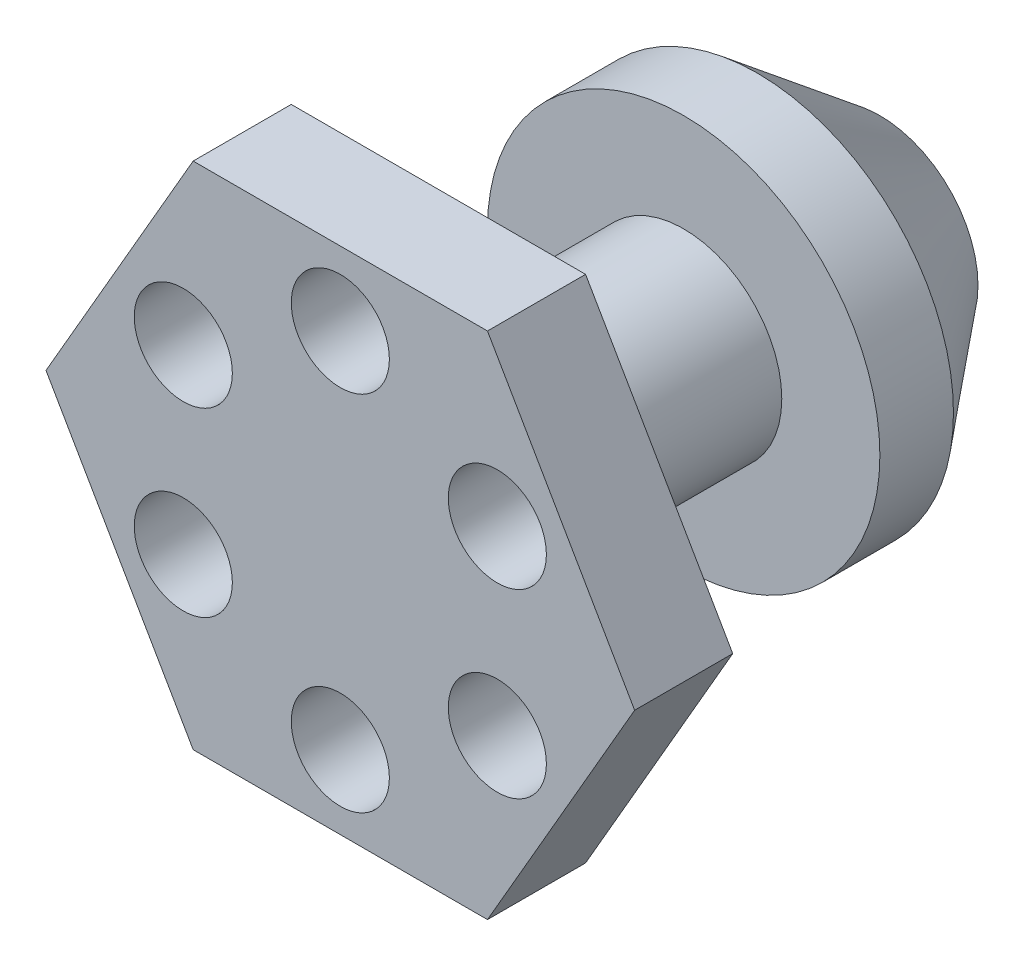
ISO-10303-21;
HEADER;
FILE_DESCRIPTION(('STEP AP214'),'2;1');
FILE_NAME('part.step','',(''),(''),'','','');
FILE_SCHEMA(('AUTOMOTIVE_DESIGN { 1 0 10303 214 1 1 1 1 }'));
ENDSEC;
DATA;
#1=APPLICATION_CONTEXT('core data for automotive mechanical design processes');
#2=APPLICATION_PROTOCOL_DEFINITION('international standard','automotive_design',2000,#1);
#3=PRODUCT_CONTEXT('',#1,'mechanical');
#4=PRODUCT('Part','Part','',(#3));
#5=PRODUCT_RELATED_PRODUCT_CATEGORY('part','',(#4));
#6=PRODUCT_DEFINITION_FORMATION('','',#4);
#7=PRODUCT_DEFINITION_CONTEXT('part definition',#1,'design');
#8=PRODUCT_DEFINITION('design','',#6,#7);
#9=PRODUCT_DEFINITION_SHAPE('','',#8);
#10=(LENGTH_UNIT() NAMED_UNIT(*) SI_UNIT(.MILLI.,.METRE.));
#11=(NAMED_UNIT(*) PLANE_ANGLE_UNIT() SI_UNIT($,.RADIAN.));
#12=(NAMED_UNIT(*) SI_UNIT($,.STERADIAN.) SOLID_ANGLE_UNIT());
#13=UNCERTAINTY_MEASURE_WITH_UNIT(LENGTH_MEASURE(1.E-05),#10,'distance_accuracy_value','');
#14=(GEOMETRIC_REPRESENTATION_CONTEXT(3) GLOBAL_UNCERTAINTY_ASSIGNED_CONTEXT((#13)) GLOBAL_UNIT_ASSIGNED_CONTEXT((#10,
#11,#12)) REPRESENTATION_CONTEXT('',''));
#15=CARTESIAN_POINT('',(0.,0.,0.));
#16=DIRECTION('',(0.,0.,1.));
#17=DIRECTION('',(1.,0.,0.));
#18=AXIS2_PLACEMENT_3D('',#15,#16,#17);
#19=CARTESIAN_POINT('',(0.,0.,25.4));
#20=DIRECTION('',(0.,0.,1.));
#21=DIRECTION('',(1.,0.,0.));
#22=AXIS2_PLACEMENT_3D('',#19,#20,#21);
#23=PLANE('',#22);
#24=CARTESIAN_POINT('',(40.6522160579066,23.4705678841867,25.4));
#25=DIRECTION('',(0.,0.,1.));
#26=DIRECTION('',(1.,0.,0.));
#27=AXIS2_PLACEMENT_3D('',#24,#25,#26);
#28=CIRCLE('',#27,12.7);
#29=CARTESIAN_POINT('',(53.3522160579066,23.4705678841867,25.4));
#30=VERTEX_POINT('',#29);
#31=EDGE_CURVE('E173',#30,#30,#28,.T.);
#32=ORIENTED_EDGE('',*,*,#31,.F.);
#33=EDGE_LOOP('',(#32));
#34=FACE_BOUND('',#33,.T.);
#35=CARTESIAN_POINT('',(-40.6522160579063,23.4705678841873,25.4));
#36=DIRECTION('',(0.,0.,1.));
#37=DIRECTION('',(1.,0.,0.));
#38=AXIS2_PLACEMENT_3D('',#35,#36,#37);
#39=CIRCLE('',#38,12.7);
#40=CARTESIAN_POINT('',(-27.9522160579063,23.4705678841873,25.4));
#41=VERTEX_POINT('',#40);
#42=EDGE_CURVE('E161',#41,#41,#39,.T.);
#43=ORIENTED_EDGE('',*,*,#42,.F.);
#44=EDGE_LOOP('',(#43));
#45=FACE_BOUND('',#44,.T.);
#46=CARTESIAN_POINT('',(0.,-46.9411357683741,25.4));
#47=DIRECTION('',(0.,0.,1.));
#48=DIRECTION('',(1.,0.,0.));
#49=AXIS2_PLACEMENT_3D('',#46,#47,#48);
#50=CIRCLE('',#49,12.7);
#51=CARTESIAN_POINT('',(12.7,-46.9411357683741,25.4));
#52=VERTEX_POINT('',#51);
#53=EDGE_CURVE('E125',#52,#52,#50,.T.);
#54=ORIENTED_EDGE('',*,*,#53,.F.);
#55=EDGE_LOOP('',(#54));
#56=FACE_BOUND('',#55,.T.);
#57=DIRECTION('',(-0.499999999999995,-0.866025403784441,0.));
#58=VECTOR('',#57,1.);
#59=CARTESIAN_POINT('',(-38.1000000000007,65.9911357683737,25.4));
#60=LINE('',#59,#58);
#61=CARTESIAN_POINT('',(-38.1000000000007,65.9911357683737,25.4));
#62=VERTEX_POINT('',#61);
#63=CARTESIAN_POINT('',(-76.1999999999999,0.,25.4));
#64=VERTEX_POINT('',#63);
#65=EDGE_CURVE('E132',#62,#64,#60,.T.);
#66=ORIENTED_EDGE('',*,*,#65,.T.);
#67=DIRECTION('',(0.500000000000001,-0.866025403784438,0.));
#68=VECTOR('',#67,1.);
#69=CARTESIAN_POINT('',(-76.1999999999999,0.,25.4));
#70=LINE('',#69,#68);
#71=CARTESIAN_POINT('',(-38.0999999999998,-65.9911357683742,25.4));
#72=VERTEX_POINT('',#71);
#73=EDGE_CURVE('E90',#64,#72,#70,.T.);
#74=ORIENTED_EDGE('',*,*,#73,.T.);
#75=DIRECTION('',(1.,0.,0.));
#76=VECTOR('',#75,1.);
#77=CARTESIAN_POINT('',(-38.0999999999998,-65.9911357683742,25.4));
#78=LINE('',#77,#76);
#79=CARTESIAN_POINT('',(38.1000000000002,-65.9911357683739,25.4));
#80=VERTEX_POINT('',#79);
#81=EDGE_CURVE('E103',#72,#80,#78,.T.);
#82=ORIENTED_EDGE('',*,*,#81,.T.);
#83=DIRECTION('',(0.499999999999995,0.866025403784441,0.));
#84=VECTOR('',#83,1.);
#85=CARTESIAN_POINT('',(38.1000000000002,-65.9911357683739,25.4));
#86=LINE('',#85,#84);
#87=CARTESIAN_POINT('',(76.1999999999999,5.32101756039693E-13,25.4));
#88=VERTEX_POINT('',#87);
#89=EDGE_CURVE('E97',#80,#88,#86,.T.);
#90=ORIENTED_EDGE('',*,*,#89,.T.);
#91=DIRECTION('',(-0.500000000000007,0.866025403784434,0.));
#92=VECTOR('',#91,1.);
#93=CARTESIAN_POINT('',(76.1999999999999,5.32101756039693E-13,25.4));
#94=LINE('',#93,#92);
#95=CARTESIAN_POINT('',(38.0999999999993,65.9911357683744,25.4));
#96=VERTEX_POINT('',#95);
#97=EDGE_CURVE('E101',#88,#96,#94,.T.);
#98=ORIENTED_EDGE('',*,*,#97,.T.);
#99=DIRECTION('',(-1.,0.,0.));
#100=VECTOR('',#99,1.);
#101=CARTESIAN_POINT('',(38.0999999999993,65.9911357683744,25.4));
#102=LINE('',#101,#100);
#103=EDGE_CURVE('E52',#96,#62,#102,.T.);
#104=ORIENTED_EDGE('',*,*,#103,.T.);
#105=EDGE_LOOP('',(#66,#74,#82,#90,#98,#104));
#106=FACE_BOUND('',#105,.T.);
#107=CARTESIAN_POINT('',(-40.6522160579064,-23.470567884187,25.4));
#108=DIRECTION('',(0.,0.,1.));
#109=DIRECTION('',(1.,0.,0.));
#110=AXIS2_PLACEMENT_3D('',#107,#108,#109);
#111=CIRCLE('',#110,12.7);
#112=CARTESIAN_POINT('',(-27.9522160579064,-23.470567884187,25.4));
#113=VERTEX_POINT('',#112);
#114=EDGE_CURVE('E155',#113,#113,#111,.T.);
#115=ORIENTED_EDGE('',*,*,#114,.F.);
#116=EDGE_LOOP('',(#115));
#117=FACE_BOUND('',#116,.T.);
#118=CARTESIAN_POINT('',(3.27922391333972E-13,46.9411357683741,25.4));
#119=DIRECTION('',(0.,0.,1.));
#120=DIRECTION('',(1.,0.,0.));
#121=AXIS2_PLACEMENT_3D('',#118,#119,#120);
#122=CIRCLE('',#121,12.7);
#123=CARTESIAN_POINT('',(12.7000000000003,46.9411357683741,25.4));
#124=VERTEX_POINT('',#123);
#125=EDGE_CURVE('E167',#124,#124,#122,.T.);
#126=ORIENTED_EDGE('',*,*,#125,.F.);
#127=EDGE_LOOP('',(#126));
#128=FACE_BOUND('',#127,.T.);
#129=CARTESIAN_POINT('',(40.6522160579061,-23.4705678841875,25.4));
#130=DIRECTION('',(0.,0.,1.));
#131=DIRECTION('',(1.,0.,0.));
#132=AXIS2_PLACEMENT_3D('',#129,#130,#131);
#133=CIRCLE('',#132,12.7);
#134=CARTESIAN_POINT('',(53.3522160579061,-23.4705678841875,25.4));
#135=VERTEX_POINT('',#134);
#136=EDGE_CURVE('E179',#135,#135,#133,.T.);
#137=ORIENTED_EDGE('',*,*,#136,.F.);
#138=EDGE_LOOP('',(#137));
#139=FACE_BOUND('',#138,.T.);
#140=ADVANCED_FACE('F34',(#34,#45,#56,#106,#117,#128,#139),#23,.T.);
#141=CARTESIAN_POINT('',(0.,0.,0.));
#142=DIRECTION('',(0.,0.,1.));
#143=DIRECTION('',(1.,0.,0.));
#144=AXIS2_PLACEMENT_3D('',#141,#142,#143);
#145=PLANE('',#144);
#146=CARTESIAN_POINT('',(0.,0.,0.));
#147=DIRECTION('',(0.,0.,1.));
#148=DIRECTION('',(1.,0.,0.));
#149=AXIS2_PLACEMENT_3D('',#146,#147,#148);
#150=CIRCLE('',#149,25.4);
#151=CARTESIAN_POINT('',(25.4,0.,0.));
#152=VERTEX_POINT('',#151);
#153=EDGE_CURVE('E11',#152,#152,#150,.F.);
#154=ORIENTED_EDGE('',*,*,#153,.F.);
#155=EDGE_LOOP('',(#154));
#156=FACE_BOUND('',#155,.T.);
#157=DIRECTION('',(-0.499999999999995,-0.866025403784441,0.));
#158=VECTOR('',#157,1.);
#159=CARTESIAN_POINT('',(-38.1000000000007,65.9911357683737,0.));
#160=LINE('',#159,#158);
#161=CARTESIAN_POINT('',(-38.1000000000007,65.9911357683737,0.));
#162=VERTEX_POINT('',#161);
#163=CARTESIAN_POINT('',(-76.1999999999999,0.,0.));
#164=VERTEX_POINT('',#163);
#165=EDGE_CURVE('E121',#162,#164,#160,.T.);
#166=ORIENTED_EDGE('',*,*,#165,.F.);
#167=DIRECTION('',(-1.,0.,0.));
#168=VECTOR('',#167,1.);
#169=CARTESIAN_POINT('',(38.0999999999993,65.9911357683744,0.));
#170=LINE('',#169,#168);
#171=CARTESIAN_POINT('',(38.0999999999993,65.9911357683744,0.));
#172=VERTEX_POINT('',#171);
#173=EDGE_CURVE('E81',#172,#162,#170,.T.);
#174=ORIENTED_EDGE('',*,*,#173,.F.);
#175=DIRECTION('',(-0.500000000000007,0.866025403784434,0.));
#176=VECTOR('',#175,1.);
#177=CARTESIAN_POINT('',(76.1999999999999,5.32101756039693E-13,0.));
#178=LINE('',#177,#176);
#179=CARTESIAN_POINT('',(76.1999999999999,5.32101756039693E-13,0.));
#180=VERTEX_POINT('',#179);
#181=EDGE_CURVE('E75',#180,#172,#178,.T.);
#182=ORIENTED_EDGE('',*,*,#181,.F.);
#183=DIRECTION('',(0.499999999999995,0.866025403784441,0.));
#184=VECTOR('',#183,1.);
#185=CARTESIAN_POINT('',(38.1000000000002,-65.9911357683739,0.));
#186=LINE('',#185,#184);
#187=CARTESIAN_POINT('',(38.1000000000002,-65.9911357683739,0.));
#188=VERTEX_POINT('',#187);
#189=EDGE_CURVE('E111',#188,#180,#186,.T.);
#190=ORIENTED_EDGE('',*,*,#189,.F.);
#191=DIRECTION('',(1.,0.,0.));
#192=VECTOR('',#191,1.);
#193=CARTESIAN_POINT('',(-38.0999999999998,-65.9911357683742,0.));
#194=LINE('',#193,#192);
#195=CARTESIAN_POINT('',(-38.0999999999998,-65.9911357683742,0.));
#196=VERTEX_POINT('',#195);
#197=EDGE_CURVE('E127',#196,#188,#194,.T.);
#198=ORIENTED_EDGE('',*,*,#197,.F.);
#199=DIRECTION('',(0.500000000000001,-0.866025403784438,0.));
#200=VECTOR('',#199,1.);
#201=CARTESIAN_POINT('',(-76.1999999999999,0.,0.));
#202=LINE('',#201,#200);
#203=EDGE_CURVE('E124',#164,#196,#202,.T.);
#204=ORIENTED_EDGE('',*,*,#203,.F.);
#205=EDGE_LOOP('',(#166,#174,#182,#190,#198,#204));
#206=FACE_BOUND('',#205,.T.);
#207=CARTESIAN_POINT('',(0.,-46.9411357683741,0.));
#208=DIRECTION('',(0.,0.,1.));
#209=DIRECTION('',(1.,0.,0.));
#210=AXIS2_PLACEMENT_3D('',#207,#208,#209);
#211=CIRCLE('',#210,12.7);
#212=CARTESIAN_POINT('',(12.7,-46.9411357683741,0.));
#213=VERTEX_POINT('',#212);
#214=EDGE_CURVE('E152',#213,#213,#211,.T.);
#215=ORIENTED_EDGE('',*,*,#214,.T.);
#216=EDGE_LOOP('',(#215));
#217=FACE_BOUND('',#216,.T.);
#218=CARTESIAN_POINT('',(-40.6522160579064,-23.470567884187,0.));
#219=DIRECTION('',(0.,0.,1.));
#220=DIRECTION('',(1.,0.,0.));
#221=AXIS2_PLACEMENT_3D('',#218,#219,#220);
#222=CIRCLE('',#221,12.7);
#223=CARTESIAN_POINT('',(-27.9522160579064,-23.470567884187,0.));
#224=VERTEX_POINT('',#223);
#225=EDGE_CURVE('E158',#224,#224,#222,.T.);
#226=ORIENTED_EDGE('',*,*,#225,.T.);
#227=EDGE_LOOP('',(#226));
#228=FACE_BOUND('',#227,.T.);
#229=CARTESIAN_POINT('',(-40.6522160579063,23.4705678841873,0.));
#230=DIRECTION('',(0.,0.,1.));
#231=DIRECTION('',(1.,0.,0.));
#232=AXIS2_PLACEMENT_3D('',#229,#230,#231);
#233=CIRCLE('',#232,12.7);
#234=CARTESIAN_POINT('',(-27.9522160579063,23.4705678841873,0.));
#235=VERTEX_POINT('',#234);
#236=EDGE_CURVE('E164',#235,#235,#233,.T.);
#237=ORIENTED_EDGE('',*,*,#236,.T.);
#238=EDGE_LOOP('',(#237));
#239=FACE_BOUND('',#238,.T.);
#240=CARTESIAN_POINT('',(3.27922391333972E-13,46.9411357683741,0.));
#241=DIRECTION('',(0.,0.,1.));
#242=DIRECTION('',(1.,0.,0.));
#243=AXIS2_PLACEMENT_3D('',#240,#241,#242);
#244=CIRCLE('',#243,12.7);
#245=CARTESIAN_POINT('',(12.7000000000003,46.9411357683741,0.));
#246=VERTEX_POINT('',#245);
#247=EDGE_CURVE('E170',#246,#246,#244,.T.);
#248=ORIENTED_EDGE('',*,*,#247,.T.);
#249=EDGE_LOOP('',(#248));
#250=FACE_BOUND('',#249,.T.);
#251=CARTESIAN_POINT('',(40.6522160579066,23.4705678841867,0.));
#252=DIRECTION('',(0.,0.,1.));
#253=DIRECTION('',(1.,0.,0.));
#254=AXIS2_PLACEMENT_3D('',#251,#252,#253);
#255=CIRCLE('',#254,12.7);
#256=CARTESIAN_POINT('',(53.3522160579066,23.4705678841867,0.));
#257=VERTEX_POINT('',#256);
#258=EDGE_CURVE('E176',#257,#257,#255,.T.);
#259=ORIENTED_EDGE('',*,*,#258,.T.);
#260=EDGE_LOOP('',(#259));
#261=FACE_BOUND('',#260,.T.);
#262=CARTESIAN_POINT('',(40.6522160579061,-23.4705678841875,0.));
#263=DIRECTION('',(0.,0.,1.));
#264=DIRECTION('',(1.,0.,0.));
#265=AXIS2_PLACEMENT_3D('',#262,#263,#264);
#266=CIRCLE('',#265,12.7);
#267=CARTESIAN_POINT('',(53.3522160579061,-23.4705678841875,0.));
#268=VERTEX_POINT('',#267);
#269=EDGE_CURVE('E182',#268,#268,#266,.T.);
#270=ORIENTED_EDGE('',*,*,#269,.T.);
#271=EDGE_LOOP('',(#270));
#272=FACE_BOUND('',#271,.T.);
#273=ADVANCED_FACE('F144',(#156,#206,#217,#228,#239,#250,#261,#272),#145,.F.);
#274=CARTESIAN_POINT('',(-38.1000000000007,65.9911357683737,25.4));
#275=DIRECTION('',(0.866025403784441,-0.499999999999995,0.));
#276=DIRECTION('',(0.499999999999995,0.866025403784441,0.));
#277=AXIS2_PLACEMENT_3D('',#274,#275,#276);
#278=PLANE('',#277);
#279=ORIENTED_EDGE('',*,*,#165,.T.);
#280=DIRECTION('',(0.,0.,-1.));
#281=VECTOR('',#280,1.);
#282=CARTESIAN_POINT('',(-76.1999999999999,0.,25.4));
#283=LINE('',#282,#281);
#284=EDGE_CURVE('E44',#64,#164,#283,.T.);
#285=ORIENTED_EDGE('',*,*,#284,.F.);
#286=ORIENTED_EDGE('',*,*,#65,.F.);
#287=DIRECTION('',(0.,0.,-1.));
#288=VECTOR('',#287,1.);
#289=CARTESIAN_POINT('',(-38.1000000000007,65.9911357683737,25.4));
#290=LINE('',#289,#288);
#291=EDGE_CURVE('E117',#62,#162,#290,.T.);
#292=ORIENTED_EDGE('',*,*,#291,.T.);
#293=EDGE_LOOP('',(#279,#285,#286,#292));
#294=FACE_BOUND('',#293,.T.);
#295=ADVANCED_FACE('F36',(#294),#278,.F.);
#296=CARTESIAN_POINT('',(-76.1999999999999,0.,25.4));
#297=DIRECTION('',(0.866025403784438,0.500000000000001,0.));
#298=DIRECTION('',(-0.500000000000001,0.866025403784438,0.));
#299=AXIS2_PLACEMENT_3D('',#296,#297,#298);
#300=PLANE('',#299);
#301=ORIENTED_EDGE('',*,*,#203,.T.);
#302=DIRECTION('',(0.,0.,-1.));
#303=VECTOR('',#302,1.);
#304=CARTESIAN_POINT('',(-38.0999999999998,-65.9911357683742,25.4));
#305=LINE('',#304,#303);
#306=EDGE_CURVE('E136',#72,#196,#305,.T.);
#307=ORIENTED_EDGE('',*,*,#306,.F.);
#308=ORIENTED_EDGE('',*,*,#73,.F.);
#309=ORIENTED_EDGE('',*,*,#284,.T.);
#310=EDGE_LOOP('',(#301,#307,#308,#309));
#311=FACE_BOUND('',#310,.T.);
#312=ADVANCED_FACE('F139',(#311),#300,.F.);
#313=CARTESIAN_POINT('',(-38.0999999999998,-65.9911357683742,25.4));
#314=DIRECTION('',(0.,1.,0.));
#315=DIRECTION('',(-1.,0.,0.));
#316=AXIS2_PLACEMENT_3D('',#313,#314,#315);
#317=PLANE('',#316);
#318=ORIENTED_EDGE('',*,*,#197,.T.);
#319=DIRECTION('',(0.,0.,-1.));
#320=VECTOR('',#319,1.);
#321=CARTESIAN_POINT('',(38.1000000000002,-65.9911357683739,25.4));
#322=LINE('',#321,#320);
#323=EDGE_CURVE('E112',#80,#188,#322,.T.);
#324=ORIENTED_EDGE('',*,*,#323,.F.);
#325=ORIENTED_EDGE('',*,*,#81,.F.);
#326=ORIENTED_EDGE('',*,*,#306,.T.);
#327=EDGE_LOOP('',(#318,#324,#325,#326));
#328=FACE_BOUND('',#327,.T.);
#329=ADVANCED_FACE('F148',(#328),#317,.F.);
#330=CARTESIAN_POINT('',(38.1000000000002,-65.9911357683739,25.4));
#331=DIRECTION('',(-0.866025403784441,0.499999999999995,0.));
#332=DIRECTION('',(-0.499999999999995,-0.866025403784442,0.));
#333=AXIS2_PLACEMENT_3D('',#330,#331,#332);
#334=PLANE('',#333);
#335=ORIENTED_EDGE('',*,*,#189,.T.);
#336=DIRECTION('',(0.,0.,-1.));
#337=VECTOR('',#336,1.);
#338=CARTESIAN_POINT('',(76.1999999999999,5.32101756039693E-13,25.4));
#339=LINE('',#338,#337);
#340=EDGE_CURVE('E108',#88,#180,#339,.T.);
#341=ORIENTED_EDGE('',*,*,#340,.F.);
#342=ORIENTED_EDGE('',*,*,#89,.F.);
#343=ORIENTED_EDGE('',*,*,#323,.T.);
#344=EDGE_LOOP('',(#335,#341,#342,#343));
#345=FACE_BOUND('',#344,.T.);
#346=ADVANCED_FACE('F109',(#345),#334,.F.);
#347=CARTESIAN_POINT('',(76.1999999999999,5.32101756039693E-13,25.4));
#348=DIRECTION('',(-0.866025403784435,-0.500000000000007,0.));
#349=DIRECTION('',(0.500000000000007,-0.866025403784435,0.));
#350=AXIS2_PLACEMENT_3D('',#347,#348,#349);
#351=PLANE('',#350);
#352=ORIENTED_EDGE('',*,*,#181,.T.);
#353=DIRECTION('',(0.,0.,-1.));
#354=VECTOR('',#353,1.);
#355=CARTESIAN_POINT('',(38.0999999999993,65.9911357683744,25.4));
#356=LINE('',#355,#354);
#357=EDGE_CURVE('E113',#96,#172,#356,.T.);
#358=ORIENTED_EDGE('',*,*,#357,.F.);
#359=ORIENTED_EDGE('',*,*,#97,.F.);
#360=ORIENTED_EDGE('',*,*,#340,.T.);
#361=EDGE_LOOP('',(#352,#358,#359,#360));
#362=FACE_BOUND('',#361,.T.);
#363=ADVANCED_FACE('F115',(#362),#351,.F.);
#364=CARTESIAN_POINT('',(38.0999999999993,65.9911357683744,25.4));
#365=DIRECTION('',(0.,-1.,0.));
#366=DIRECTION('',(1.,0.,0.));
#367=AXIS2_PLACEMENT_3D('',#364,#365,#366);
#368=PLANE('',#367);
#369=ORIENTED_EDGE('',*,*,#173,.T.);
#370=ORIENTED_EDGE('',*,*,#291,.F.);
#371=ORIENTED_EDGE('',*,*,#103,.F.);
#372=ORIENTED_EDGE('',*,*,#357,.T.);
#373=EDGE_LOOP('',(#369,#370,#371,#372));
#374=FACE_BOUND('',#373,.T.);
#375=ADVANCED_FACE('F316',(#374),#368,.F.);
#376=CARTESIAN_POINT('',(0.,-46.9411357683741,25.4));
#377=DIRECTION('',(0.,0.,-1.));
#378=DIRECTION('',(-1.,0.,0.));
#379=AXIS2_PLACEMENT_3D('',#376,#377,#378);
#380=CYLINDRICAL_SURFACE('',#379,12.7);
#381=ORIENTED_EDGE('',*,*,#53,.T.);
#382=EDGE_LOOP('',(#381));
#383=FACE_BOUND('',#382,.T.);
#384=ORIENTED_EDGE('',*,*,#214,.F.);
#385=EDGE_LOOP('',(#384));
#386=FACE_BOUND('',#385,.T.);
#387=ADVANCED_FACE('F313',(#383,#386),#380,.F.);
#388=CARTESIAN_POINT('',(-40.6522160579064,-23.470567884187,25.4));
#389=DIRECTION('',(0.,0.,-1.));
#390=DIRECTION('',(-1.,0.,0.));
#391=AXIS2_PLACEMENT_3D('',#388,#389,#390);
#392=CYLINDRICAL_SURFACE('',#391,12.7);
#393=ORIENTED_EDGE('',*,*,#114,.T.);
#394=EDGE_LOOP('',(#393));
#395=FACE_BOUND('',#394,.T.);
#396=ORIENTED_EDGE('',*,*,#225,.F.);
#397=EDGE_LOOP('',(#396));
#398=FACE_BOUND('',#397,.T.);
#399=ADVANCED_FACE('F309',(#395,#398),#392,.F.);
#400=CARTESIAN_POINT('',(-40.6522160579063,23.4705678841873,25.4));
#401=DIRECTION('',(0.,0.,-1.));
#402=DIRECTION('',(-1.,0.,0.));
#403=AXIS2_PLACEMENT_3D('',#400,#401,#402);
#404=CYLINDRICAL_SURFACE('',#403,12.7);
#405=ORIENTED_EDGE('',*,*,#42,.T.);
#406=EDGE_LOOP('',(#405));
#407=FACE_BOUND('',#406,.T.);
#408=ORIENTED_EDGE('',*,*,#236,.F.);
#409=EDGE_LOOP('',(#408));
#410=FACE_BOUND('',#409,.T.);
#411=ADVANCED_FACE('F305',(#407,#410),#404,.F.);
#412=CARTESIAN_POINT('',(3.27922391333972E-13,46.9411357683741,25.4));
#413=DIRECTION('',(0.,0.,-1.));
#414=DIRECTION('',(-1.,0.,0.));
#415=AXIS2_PLACEMENT_3D('',#412,#413,#414);
#416=CYLINDRICAL_SURFACE('',#415,12.7);
#417=ORIENTED_EDGE('',*,*,#125,.T.);
#418=EDGE_LOOP('',(#417));
#419=FACE_BOUND('',#418,.T.);
#420=ORIENTED_EDGE('',*,*,#247,.F.);
#421=EDGE_LOOP('',(#420));
#422=FACE_BOUND('',#421,.T.);
#423=ADVANCED_FACE('F301',(#419,#422),#416,.F.);
#424=CARTESIAN_POINT('',(40.6522160579066,23.4705678841867,25.4));
#425=DIRECTION('',(0.,0.,-1.));
#426=DIRECTION('',(-1.,0.,0.));
#427=AXIS2_PLACEMENT_3D('',#424,#425,#426);
#428=CYLINDRICAL_SURFACE('',#427,12.7);
#429=ORIENTED_EDGE('',*,*,#31,.T.);
#430=EDGE_LOOP('',(#429));
#431=FACE_BOUND('',#430,.T.);
#432=ORIENTED_EDGE('',*,*,#258,.F.);
#433=EDGE_LOOP('',(#432));
#434=FACE_BOUND('',#433,.T.);
#435=ADVANCED_FACE('F297',(#431,#434),#428,.F.);
#436=CARTESIAN_POINT('',(40.6522160579061,-23.4705678841875,25.4));
#437=DIRECTION('',(0.,0.,-1.));
#438=DIRECTION('',(-1.,0.,0.));
#439=AXIS2_PLACEMENT_3D('',#436,#437,#438);
#440=CYLINDRICAL_SURFACE('',#439,12.7);
#441=ORIENTED_EDGE('',*,*,#136,.T.);
#442=EDGE_LOOP('',(#441));
#443=FACE_BOUND('',#442,.T.);
#444=ORIENTED_EDGE('',*,*,#269,.F.);
#445=EDGE_LOOP('',(#444));
#446=FACE_BOUND('',#445,.T.);
#447=ADVANCED_FACE('F250',(#443,#446),#440,.F.);
#448=CARTESIAN_POINT('',(0.,0.,-33.1865817842497));
#449=DIRECTION('',(0.,0.,1.));
#450=DIRECTION('',(1.,0.,0.));
#451=AXIS2_PLACEMENT_3D('',#448,#449,#450);
#452=CYLINDRICAL_SURFACE('',#451,25.4);
#453=ORIENTED_EDGE('',*,*,#153,.T.);
#454=EDGE_LOOP('',(#453));
#455=FACE_BOUND('',#454,.T.);
#456=CARTESIAN_POINT('',(0.,0.,-63.5));
#457=DIRECTION('',(0.,0.,1.));
#458=DIRECTION('',(1.,0.,0.));
#459=AXIS2_PLACEMENT_3D('',#456,#457,#458);
#460=CIRCLE('',#459,25.4);
#461=CARTESIAN_POINT('',(25.4,0.,-63.5));
#462=VERTEX_POINT('',#461);
#463=EDGE_CURVE('E214',#462,#462,#460,.T.);
#464=ORIENTED_EDGE('',*,*,#463,.T.);
#465=EDGE_LOOP('',(#464));
#466=FACE_BOUND('',#465,.T.);
#467=ADVANCED_FACE('F246',(#455,#466),#452,.T.);
#468=CARTESIAN_POINT('',(50.8,0.,-63.5));
#469=DIRECTION('',(0.,0.,-1.));
#470=DIRECTION('',(-1.,0.,0.));
#471=AXIS2_PLACEMENT_3D('',#468,#469,#470);
#472=PLANE('',#471);
#473=ORIENTED_EDGE('',*,*,#463,.F.);
#474=EDGE_LOOP('',(#473));
#475=FACE_BOUND('',#474,.T.);
#476=CARTESIAN_POINT('',(0.,0.,-63.5));
#477=DIRECTION('',(0.,0.,1.));
#478=DIRECTION('',(1.,0.,0.));
#479=AXIS2_PLACEMENT_3D('',#476,#477,#478);
#480=CIRCLE('',#479,50.8);
#481=CARTESIAN_POINT('',(50.8,0.,-63.5));
#482=VERTEX_POINT('',#481);
#483=EDGE_CURVE('E211',#482,#482,#480,.T.);
#484=ORIENTED_EDGE('',*,*,#483,.T.);
#485=EDGE_LOOP('',(#484));
#486=FACE_BOUND('',#485,.T.);
#487=ADVANCED_FACE('F249',(#475,#486),#472,.F.);
#488=CARTESIAN_POINT('',(0.,0.,-33.1865817842497));
#489=DIRECTION('',(0.,0.,1.));
#490=DIRECTION('',(1.,0.,0.));
#491=AXIS2_PLACEMENT_3D('',#488,#489,#490);
#492=CYLINDRICAL_SURFACE('',#491,50.8);
#493=ORIENTED_EDGE('',*,*,#483,.F.);
#494=EDGE_LOOP('',(#493));
#495=FACE_BOUND('',#494,.T.);
#496=CARTESIAN_POINT('',(0.,0.,-82.55));
#497=DIRECTION('',(0.,0.,1.));
#498=DIRECTION('',(1.,0.,0.));
#499=AXIS2_PLACEMENT_3D('',#496,#497,#498);
#500=CIRCLE('',#499,50.8);
#501=CARTESIAN_POINT('',(50.8,0.,-82.55));
#502=VERTEX_POINT('',#501);
#503=EDGE_CURVE('E208',#502,#502,#500,.T.);
#504=ORIENTED_EDGE('',*,*,#503,.T.);
#505=EDGE_LOOP('',(#504));
#506=FACE_BOUND('',#505,.T.);
#507=ADVANCED_FACE('F256',(#495,#506),#492,.T.);
#508=CARTESIAN_POINT('',(0.,0.,-114.3));
#509=DIRECTION('',(0.,0.,1.));
#510=DIRECTION('',(1.,0.,0.));
#511=AXIS2_PLACEMENT_3D('',#508,#509,#510);
#512=CONICAL_SURFACE('',#511,25.4,0.674740942223552);
#513=ORIENTED_EDGE('',*,*,#503,.F.);
#514=EDGE_LOOP('',(#513));
#515=FACE_BOUND('',#514,.T.);
#516=CARTESIAN_POINT('',(0.,0.,-114.3));
#517=DIRECTION('',(0.,0.,1.));
#518=DIRECTION('',(1.,0.,0.));
#519=AXIS2_PLACEMENT_3D('',#516,#517,#518);
#520=CIRCLE('',#519,25.4);
#521=CARTESIAN_POINT('',(25.4,0.,-114.3));
#522=VERTEX_POINT('',#521);
#523=EDGE_CURVE('E205',#522,#522,#520,.T.);
#524=ORIENTED_EDGE('',*,*,#523,.T.);
#525=EDGE_LOOP('',(#524));
#526=FACE_BOUND('',#525,.T.);
#527=ADVANCED_FACE('F262',(#515,#526),#512,.T.);
#528=CARTESIAN_POINT('',(0.,0.,-114.3));
#529=DIRECTION('',(0.,0.,1.));
#530=DIRECTION('',(1.,0.,0.));
#531=AXIS2_PLACEMENT_3D('',#528,#529,#530);
#532=PLANE('',#531);
#533=ORIENTED_EDGE('',*,*,#523,.F.);
#534=EDGE_LOOP('',(#533));
#535=FACE_BOUND('',#534,.T.);
#536=ADVANCED_FACE('F268',(#535),#532,.F.);
#537=CLOSED_SHELL('',(#140,#273,#295,#312,#329,#346,#363,#375,#387,#399,#411,#423,#435,#447,
#467,#487,#507,#527,#536));
#538=CARTESIAN_POINT('',(0.,0.,0.));
#539=DIRECTION('',(0.,0.,1.));
#540=DIRECTION('',(1.,0.,0.));
#541=AXIS2_PLACEMENT_3D('',#538,#539,#540);
#542=CIRCLE('',#541,2.54);
#543=CARTESIAN_POINT('',(2.54,0.,0.));
#544=VERTEX_POINT('',#543);
#545=EDGE_CURVE('E202',#544,#544,#542,.T.);
#546=ORIENTED_EDGE('',*,*,#545,.T.);
#547=EDGE_LOOP('',(#546));
#548=FACE_BOUND('',#547,.T.);
#549=CARTESIAN_POINT('',(0.,0.,0.));
#550=DIRECTION('',(0.,0.,1.));
#551=DIRECTION('',(1.,0.,0.));
#552=AXIS2_PLACEMENT_3D('',#549,#550,#551);
#553=CIRCLE('',#552,22.86);
#554=CARTESIAN_POINT('',(22.86,0.,0.));
#555=VERTEX_POINT('',#554);
#556=EDGE_CURVE('E217',#555,#555,#553,.T.);
#557=ORIENTED_EDGE('',*,*,#556,.F.);
#558=EDGE_LOOP('',(#557));
#559=FACE_BOUND('',#558,.T.);
#560=ADVANCED_FACE('F224',(#548,#559),#145,.F.);
#561=CARTESIAN_POINT('',(0.,0.,-33.1865817842497));
#562=DIRECTION('',(0.,0.,1.));
#563=DIRECTION('',(1.,0.,0.));
#564=AXIS2_PLACEMENT_3D('',#561,#562,#563);
#565=CYLINDRICAL_SURFACE('',#564,22.86);
#566=ORIENTED_EDGE('',*,*,#556,.T.);
#567=EDGE_LOOP('',(#566));
#568=FACE_BOUND('',#567,.T.);
#569=CARTESIAN_POINT('',(0.,0.,-66.04));
#570=DIRECTION('',(0.,0.,1.));
#571=DIRECTION('',(1.,0.,0.));
#572=AXIS2_PLACEMENT_3D('',#569,#570,#571);
#573=CIRCLE('',#572,22.86);
#574=CARTESIAN_POINT('',(22.86,0.,-66.04));
#575=VERTEX_POINT('',#574);
#576=EDGE_CURVE('E185',#575,#575,#573,.T.);
#577=ORIENTED_EDGE('',*,*,#576,.F.);
#578=EDGE_LOOP('',(#577));
#579=FACE_BOUND('',#578,.T.);
#580=ADVANCED_FACE('F221',(#568,#579),#565,.F.);
#581=CARTESIAN_POINT('',(50.8,0.,-66.04));
#582=DIRECTION('',(0.,0.,-1.));
#583=DIRECTION('',(-1.,0.,0.));
#584=AXIS2_PLACEMENT_3D('',#581,#582,#583);
#585=PLANE('',#584);
#586=ORIENTED_EDGE('',*,*,#576,.T.);
#587=EDGE_LOOP('',(#586));
#588=FACE_BOUND('',#587,.T.);
#589=CARTESIAN_POINT('',(0.,0.,-66.04));
#590=DIRECTION('',(0.,0.,1.));
#591=DIRECTION('',(1.,0.,0.));
#592=AXIS2_PLACEMENT_3D('',#589,#590,#591);
#593=CIRCLE('',#592,48.26);
#594=CARTESIAN_POINT('',(48.26,0.,-66.04));
#595=VERTEX_POINT('',#594);
#596=EDGE_CURVE('E190',#595,#595,#593,.T.);
#597=ORIENTED_EDGE('',*,*,#596,.F.);
#598=EDGE_LOOP('',(#597));
#599=FACE_BOUND('',#598,.T.);
#600=ADVANCED_FACE('F233',(#588,#599),#585,.T.);
#601=CARTESIAN_POINT('',(0.,0.,-33.1865817842497));
#602=DIRECTION('',(0.,0.,1.));
#603=DIRECTION('',(1.,0.,0.));
#604=AXIS2_PLACEMENT_3D('',#601,#602,#603);
#605=CYLINDRICAL_SURFACE('',#604,48.26);
#606=ORIENTED_EDGE('',*,*,#596,.T.);
#607=EDGE_LOOP('',(#606));
#608=FACE_BOUND('',#607,.T.);
#609=CARTESIAN_POINT('',(0.,0.,-81.6590161092301));
#610=DIRECTION('',(0.,0.,1.));
#611=DIRECTION('',(1.,0.,0.));
#612=AXIS2_PLACEMENT_3D('',#609,#610,#611);
#613=CIRCLE('',#612,48.26);
#614=CARTESIAN_POINT('',(48.26,0.,-81.6590161092301));
#615=VERTEX_POINT('',#614);
#616=EDGE_CURVE('E193',#615,#615,#613,.T.);
#617=ORIENTED_EDGE('',*,*,#616,.F.);
#618=EDGE_LOOP('',(#617));
#619=FACE_BOUND('',#618,.T.);
#620=ADVANCED_FACE('F287',(#608,#619),#605,.F.);
#621=CARTESIAN_POINT('',(0.,0.,-111.76));
#622=DIRECTION('',(0.,0.,1.));
#623=DIRECTION('',(1.,0.,0.));
#624=AXIS2_PLACEMENT_3D('',#621,#622,#623);
#625=CONICAL_SURFACE('',#624,24.1792128873841,0.674740942223552);
#626=ORIENTED_EDGE('',*,*,#616,.T.);
#627=EDGE_LOOP('',(#626));
#628=FACE_BOUND('',#627,.T.);
#629=CARTESIAN_POINT('',(0.,0.,-111.76));
#630=DIRECTION('',(0.,0.,1.));
#631=DIRECTION('',(1.,0.,0.));
#632=AXIS2_PLACEMENT_3D('',#629,#630,#631);
#633=CIRCLE('',#632,24.1792128873841);
#634=CARTESIAN_POINT('',(24.1792128873841,0.,-111.76));
#635=VERTEX_POINT('',#634);
#636=EDGE_CURVE('E196',#635,#635,#633,.T.);
#637=ORIENTED_EDGE('',*,*,#636,.F.);
#638=EDGE_LOOP('',(#637));
#639=FACE_BOUND('',#638,.T.);
#640=ADVANCED_FACE('F283',(#628,#639),#625,.F.);
#641=CARTESIAN_POINT('',(0.,0.,-111.76));
#642=DIRECTION('',(0.,0.,1.));
#643=DIRECTION('',(1.,0.,0.));
#644=AXIS2_PLACEMENT_3D('',#641,#642,#643);
#645=PLANE('',#644);
#646=ORIENTED_EDGE('',*,*,#636,.T.);
#647=EDGE_LOOP('',(#646));
#648=FACE_BOUND('',#647,.T.);
#649=CARTESIAN_POINT('',(0.,0.,-111.76));
#650=DIRECTION('',(0.,0.,1.));
#651=DIRECTION('',(1.,0.,0.));
#652=AXIS2_PLACEMENT_3D('',#649,#650,#651);
#653=CIRCLE('',#652,2.54);
#654=CARTESIAN_POINT('',(2.54,0.,-111.76));
#655=VERTEX_POINT('',#654);
#656=EDGE_CURVE('E199',#655,#655,#653,.T.);
#657=ORIENTED_EDGE('',*,*,#656,.F.);
#658=EDGE_LOOP('',(#657));
#659=FACE_BOUND('',#658,.T.);
#660=ADVANCED_FACE('F279',(#648,#659),#645,.T.);
#661=CARTESIAN_POINT('',(0.,0.,-33.1865817842497));
#662=DIRECTION('',(0.,0.,1.));
#663=DIRECTION('',(1.,0.,0.));
#664=AXIS2_PLACEMENT_3D('',#661,#662,#663);
#665=CYLINDRICAL_SURFACE('',#664,2.54);
#666=ORIENTED_EDGE('',*,*,#656,.T.);
#667=EDGE_LOOP('',(#666));
#668=FACE_BOUND('',#667,.T.);
#669=ORIENTED_EDGE('',*,*,#545,.F.);
#670=EDGE_LOOP('',(#669));
#671=FACE_BOUND('',#670,.T.);
#672=ADVANCED_FACE('F276',(#668,#671),#665,.T.);
#673=CLOSED_SHELL('',(#560,#580,#600,#620,#640,#660,#672));
#674=ORIENTED_CLOSED_SHELL('',*,#673,.T.);
#675=BREP_WITH_VOIDS('B2',#537,(#674));
#676=ADVANCED_BREP_SHAPE_REPRESENTATION('',(#18,#675),#14);
#677=SHAPE_DEFINITION_REPRESENTATION(#9,#676);
ENDSEC;
END-ISO-10303-21;
